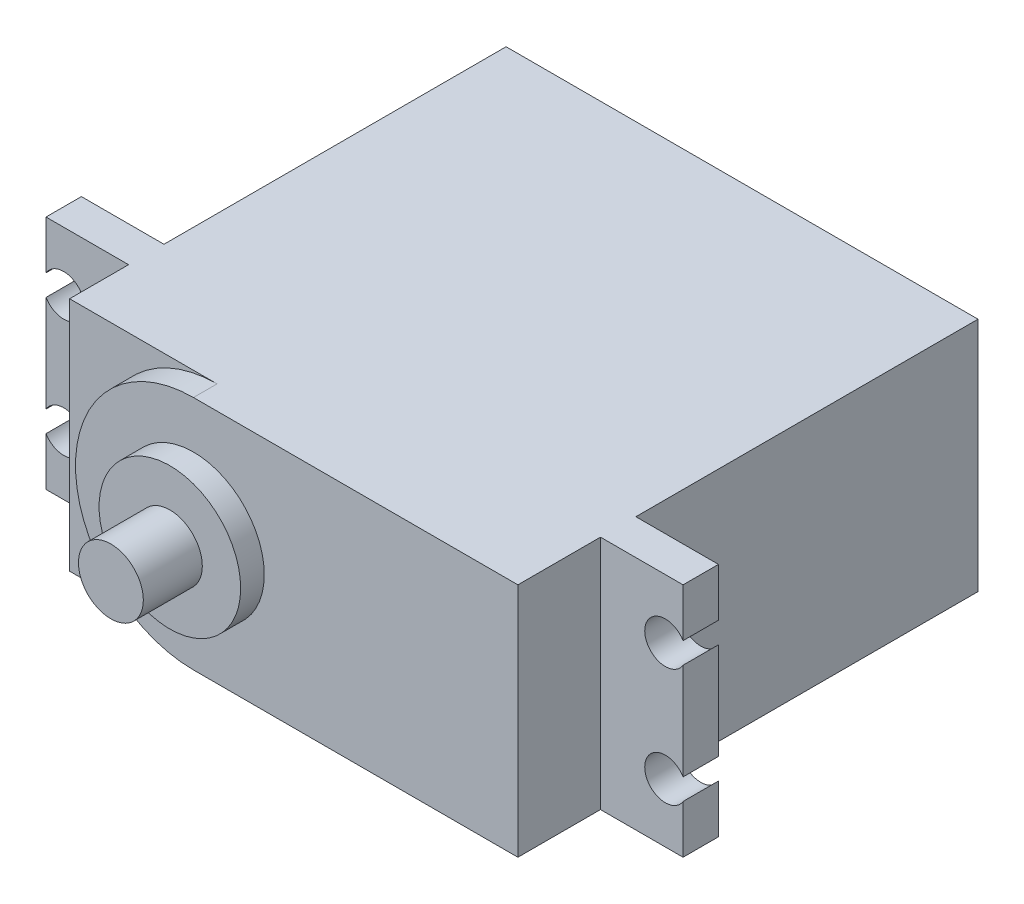
ISO-10303-21;
HEADER;
FILE_DESCRIPTION(('STEP AP214'),'2;1');
FILE_NAME('part.step','',(''),(''),'','','');
FILE_SCHEMA(('AUTOMOTIVE_DESIGN { 1 0 10303 214 1 1 1 1 }'));
ENDSEC;
DATA;
#1=APPLICATION_CONTEXT('core data for automotive mechanical design processes');
#2=APPLICATION_PROTOCOL_DEFINITION('international standard','automotive_design',2000,#1);
#3=PRODUCT_CONTEXT('',#1,'mechanical');
#4=PRODUCT('Part','Part','',(#3));
#5=PRODUCT_RELATED_PRODUCT_CATEGORY('part','',(#4));
#6=PRODUCT_DEFINITION_FORMATION('','',#4);
#7=PRODUCT_DEFINITION_CONTEXT('part definition',#1,'design');
#8=PRODUCT_DEFINITION('design','',#6,#7);
#9=PRODUCT_DEFINITION_SHAPE('','',#8);
#10=(LENGTH_UNIT() NAMED_UNIT(*) SI_UNIT(.MILLI.,.METRE.));
#11=(NAMED_UNIT(*) PLANE_ANGLE_UNIT() SI_UNIT($,.RADIAN.));
#12=(NAMED_UNIT(*) SI_UNIT($,.STERADIAN.) SOLID_ANGLE_UNIT());
#13=UNCERTAINTY_MEASURE_WITH_UNIT(LENGTH_MEASURE(1.E-05),#10,'distance_accuracy_value','');
#14=(GEOMETRIC_REPRESENTATION_CONTEXT(3) GLOBAL_UNCERTAINTY_ASSIGNED_CONTEXT((#13)) GLOBAL_UNIT_ASSIGNED_CONTEXT((#10,
#11,#12)) REPRESENTATION_CONTEXT('',''));
#15=CARTESIAN_POINT('',(0.,0.,0.));
#16=DIRECTION('',(0.,0.,1.));
#17=DIRECTION('',(1.,0.,0.));
#18=AXIS2_PLACEMENT_3D('',#15,#16,#17);
#19=CARTESIAN_POINT('',(-27.,-10.,29.));
#20=DIRECTION('',(-1.,0.,0.));
#21=DIRECTION('',(0.,0.,1.));
#22=AXIS2_PLACEMENT_3D('',#19,#20,#21);
#23=PLANE('',#22);
#24=DIRECTION('',(0.,0.,1.));
#25=VECTOR('',#24,1.);
#26=CARTESIAN_POINT('',(-27.,-5.901387818866,0.));
#27=LINE('',#26,#25);
#28=CARTESIAN_POINT('',(-27.,-5.901387818866,29.));
#29=VERTEX_POINT('',#28);
#30=CARTESIAN_POINT('',(-27.,-5.901387818866,32.));
#31=VERTEX_POINT('',#30);
#32=EDGE_CURVE('E48',#29,#31,#27,.T.);
#33=ORIENTED_EDGE('',*,*,#32,.F.);
#34=DIRECTION('',(0.,-1.,0.));
#35=VECTOR('',#34,1.);
#36=CARTESIAN_POINT('',(-27.,-10.,29.));
#37=LINE('',#36,#35);
#38=CARTESIAN_POINT('',(-27.,-10.,29.));
#39=VERTEX_POINT('',#38);
#40=EDGE_CURVE('E386',#29,#39,#37,.T.);
#41=ORIENTED_EDGE('',*,*,#40,.T.);
#42=DIRECTION('',(0.,0.,1.));
#43=VECTOR('',#42,1.);
#44=CARTESIAN_POINT('',(-27.,-10.,29.));
#45=LINE('',#44,#43);
#46=CARTESIAN_POINT('',(-27.,-10.,32.));
#47=VERTEX_POINT('',#46);
#48=EDGE_CURVE('E274',#39,#47,#45,.T.);
#49=ORIENTED_EDGE('',*,*,#48,.T.);
#50=DIRECTION('',(0.,-1.,0.));
#51=VECTOR('',#50,1.);
#52=CARTESIAN_POINT('',(-27.,-10.,32.));
#53=LINE('',#52,#51);
#54=EDGE_CURVE('E265',#31,#47,#53,.T.);
#55=ORIENTED_EDGE('',*,*,#54,.F.);
#56=EDGE_LOOP('',(#33,#41,#49,#55));
#57=FACE_BOUND('',#56,.T.);
#58=ADVANCED_FACE('F33',(#57),#23,.T.);
#59=DIRECTION('',(0.,0.,1.));
#60=VECTOR('',#59,1.);
#61=CARTESIAN_POINT('',(-27.,-4.09861218113399,0.));
#62=LINE('',#61,#60);
#63=CARTESIAN_POINT('',(-27.,-4.09861218113399,32.));
#64=VERTEX_POINT('',#63);
#65=CARTESIAN_POINT('',(-27.,-4.09861218113399,29.));
#66=VERTEX_POINT('',#65);
#67=EDGE_CURVE('E216',#64,#66,#62,.F.);
#68=ORIENTED_EDGE('',*,*,#67,.F.);
#69=CARTESIAN_POINT('',(-27.,4.09861218113399,32.));
#70=VERTEX_POINT('',#69);
#71=EDGE_CURVE('E259',#70,#64,#53,.T.);
#72=ORIENTED_EDGE('',*,*,#71,.F.);
#73=DIRECTION('',(0.,0.,1.));
#74=VECTOR('',#73,1.);
#75=CARTESIAN_POINT('',(-27.,4.09861218113399,0.));
#76=LINE('',#75,#74);
#77=CARTESIAN_POINT('',(-27.,4.09861218113399,29.));
#78=VERTEX_POINT('',#77);
#79=EDGE_CURVE('E55',#78,#70,#76,.T.);
#80=ORIENTED_EDGE('',*,*,#79,.F.);
#81=EDGE_CURVE('E261',#78,#66,#37,.T.);
#82=ORIENTED_EDGE('',*,*,#81,.T.);
#83=EDGE_LOOP('',(#68,#72,#80,#82));
#84=FACE_BOUND('',#83,.T.);
#85=ADVANCED_FACE('F258',(#84),#23,.T.);
#86=CARTESIAN_POINT('',(27.,-10.,29.));
#87=DIRECTION('',(1.,0.,0.));
#88=DIRECTION('',(0.,0.,-1.));
#89=AXIS2_PLACEMENT_3D('',#86,#87,#88);
#90=PLANE('',#89);
#91=DIRECTION('',(0.,0.,1.));
#92=VECTOR('',#91,1.);
#93=CARTESIAN_POINT('',(27.,5.90138781886601,0.));
#94=LINE('',#93,#92);
#95=CARTESIAN_POINT('',(27.,5.90138781886601,29.));
#96=VERTEX_POINT('',#95);
#97=CARTESIAN_POINT('',(27.,5.90138781886601,32.));
#98=VERTEX_POINT('',#97);
#99=EDGE_CURVE('E241',#96,#98,#94,.T.);
#100=ORIENTED_EDGE('',*,*,#99,.F.);
#101=DIRECTION('',(0.,1.,0.));
#102=VECTOR('',#101,1.);
#103=CARTESIAN_POINT('',(27.,-10.,29.));
#104=LINE('',#103,#102);
#105=CARTESIAN_POINT('',(27.,10.,29.));
#106=VERTEX_POINT('',#105);
#107=EDGE_CURVE('E227',#96,#106,#104,.T.);
#108=ORIENTED_EDGE('',*,*,#107,.T.);
#109=DIRECTION('',(0.,0.,1.));
#110=VECTOR('',#109,1.);
#111=CARTESIAN_POINT('',(27.,10.,29.));
#112=LINE('',#111,#110);
#113=CARTESIAN_POINT('',(27.,10.,32.));
#114=VERTEX_POINT('',#113);
#115=EDGE_CURVE('E358',#106,#114,#112,.T.);
#116=ORIENTED_EDGE('',*,*,#115,.T.);
#117=DIRECTION('',(0.,1.,0.));
#118=VECTOR('',#117,1.);
#119=CARTESIAN_POINT('',(27.,-10.,32.));
#120=LINE('',#119,#118);
#121=EDGE_CURVE('E210',#98,#114,#120,.T.);
#122=ORIENTED_EDGE('',*,*,#121,.F.);
#123=EDGE_LOOP('',(#100,#108,#116,#122));
#124=FACE_BOUND('',#123,.T.);
#125=ADVANCED_FACE('F357',(#124),#90,.T.);
#126=DIRECTION('',(0.,0.,1.));
#127=VECTOR('',#126,1.);
#128=CARTESIAN_POINT('',(27.,4.09861218113399,0.));
#129=LINE('',#128,#127);
#130=CARTESIAN_POINT('',(27.,4.09861218113399,32.));
#131=VERTEX_POINT('',#130);
#132=CARTESIAN_POINT('',(27.,4.09861218113399,29.));
#133=VERTEX_POINT('',#132);
#134=EDGE_CURVE('E243',#131,#133,#129,.F.);
#135=ORIENTED_EDGE('',*,*,#134,.F.);
#136=CARTESIAN_POINT('',(27.,-4.09861218113399,32.));
#137=VERTEX_POINT('',#136);
#138=EDGE_CURVE('E208',#137,#131,#120,.T.);
#139=ORIENTED_EDGE('',*,*,#138,.F.);
#140=DIRECTION('',(0.,0.,1.));
#141=VECTOR('',#140,1.);
#142=CARTESIAN_POINT('',(27.,-4.09861218113399,0.));
#143=LINE('',#142,#141);
#144=CARTESIAN_POINT('',(27.,-4.09861218113399,29.));
#145=VERTEX_POINT('',#144);
#146=EDGE_CURVE('E186',#145,#137,#143,.T.);
#147=ORIENTED_EDGE('',*,*,#146,.F.);
#148=EDGE_CURVE('E226',#145,#133,#104,.T.);
#149=ORIENTED_EDGE('',*,*,#148,.T.);
#150=EDGE_LOOP('',(#135,#139,#147,#149));
#151=FACE_BOUND('',#150,.T.);
#152=ADVANCED_FACE('F351',(#151),#90,.T.);
#153=CARTESIAN_POINT('',(20.,-10.,37.));
#154=DIRECTION('',(-1.,0.,0.));
#155=DIRECTION('',(0.,0.,1.));
#156=AXIS2_PLACEMENT_3D('',#153,#154,#155);
#157=PLANE('',#156);
#158=DIRECTION('',(0.,-1.,0.));
#159=VECTOR('',#158,1.);
#160=CARTESIAN_POINT('',(20.,-10.,32.));
#161=LINE('',#160,#159);
#162=CARTESIAN_POINT('',(20.,10.,32.));
#163=VERTEX_POINT('',#162);
#164=CARTESIAN_POINT('',(20.,-10.,32.));
#165=VERTEX_POINT('',#164);
#166=EDGE_CURVE('E211',#163,#165,#161,.T.);
#167=ORIENTED_EDGE('',*,*,#166,.F.);
#168=DIRECTION('',(0.,0.,-1.));
#169=VECTOR('',#168,1.);
#170=CARTESIAN_POINT('',(20.,10.,37.));
#171=LINE('',#170,#169);
#172=CARTESIAN_POINT('',(20.,10.,39.));
#173=VERTEX_POINT('',#172);
#174=EDGE_CURVE('E287',#173,#163,#171,.T.);
#175=ORIENTED_EDGE('',*,*,#174,.F.);
#176=DIRECTION('',(0.,1.,0.));
#177=VECTOR('',#176,1.);
#178=CARTESIAN_POINT('',(20.,10.,39.));
#179=LINE('',#178,#177);
#180=CARTESIAN_POINT('',(20.,-10.,39.));
#181=VERTEX_POINT('',#180);
#182=EDGE_CURVE('E300',#181,#173,#179,.T.);
#183=ORIENTED_EDGE('',*,*,#182,.F.);
#184=DIRECTION('',(0.,0.,-1.));
#185=VECTOR('',#184,1.);
#186=CARTESIAN_POINT('',(20.,-10.,37.));
#187=LINE('',#186,#185);
#188=EDGE_CURVE('E332',#181,#165,#187,.T.);
#189=ORIENTED_EDGE('',*,*,#188,.T.);
#190=EDGE_LOOP('',(#167,#175,#183,#189));
#191=FACE_BOUND('',#190,.T.);
#192=ADVANCED_FACE('F418',(#191),#157,.F.);
#193=CARTESIAN_POINT('',(-20.,-10.,37.));
#194=DIRECTION('',(1.,0.,0.));
#195=DIRECTION('',(0.,0.,-1.));
#196=AXIS2_PLACEMENT_3D('',#193,#194,#195);
#197=PLANE('',#196);
#198=DIRECTION('',(0.,1.,0.));
#199=VECTOR('',#198,1.);
#200=CARTESIAN_POINT('',(-20.,-10.,32.));
#201=LINE('',#200,#199);
#202=CARTESIAN_POINT('',(-20.,-10.,32.));
#203=VERTEX_POINT('',#202);
#204=CARTESIAN_POINT('',(-20.,10.,32.));
#205=VERTEX_POINT('',#204);
#206=EDGE_CURVE('E364',#203,#205,#201,.T.);
#207=ORIENTED_EDGE('',*,*,#206,.F.);
#208=DIRECTION('',(0.,0.,-1.));
#209=VECTOR('',#208,1.);
#210=CARTESIAN_POINT('',(-20.,-10.,37.));
#211=LINE('',#210,#209);
#212=CARTESIAN_POINT('',(-20.,-10.,37.));
#213=VERTEX_POINT('',#212);
#214=EDGE_CURVE('E336',#213,#203,#211,.T.);
#215=ORIENTED_EDGE('',*,*,#214,.F.);
#216=DIRECTION('',(0.,-1.,0.));
#217=VECTOR('',#216,1.);
#218=CARTESIAN_POINT('',(-20.,-10.,37.));
#219=LINE('',#218,#217);
#220=CARTESIAN_POINT('',(-20.,10.,37.));
#221=VERTEX_POINT('',#220);
#222=EDGE_CURVE('E316',#221,#213,#219,.T.);
#223=ORIENTED_EDGE('',*,*,#222,.F.);
#224=DIRECTION('',(0.,0.,-1.));
#225=VECTOR('',#224,1.);
#226=CARTESIAN_POINT('',(-20.,10.,37.));
#227=LINE('',#226,#225);
#228=EDGE_CURVE('E340',#221,#205,#227,.T.);
#229=ORIENTED_EDGE('',*,*,#228,.T.);
#230=EDGE_LOOP('',(#207,#215,#223,#229));
#231=FACE_BOUND('',#230,.T.);
#232=ADVANCED_FACE('F404',(#231),#197,.F.);
#233=CARTESIAN_POINT('',(20.,10.,29.));
#234=VERTEX_POINT('',#233);
#235=CARTESIAN_POINT('',(20.,10.,0.));
#236=VERTEX_POINT('',#235);
#237=EDGE_CURVE('E343',#234,#236,#171,.T.);
#238=ORIENTED_EDGE('',*,*,#237,.F.);
#239=DIRECTION('',(0.,-1.,0.));
#240=VECTOR('',#239,1.);
#241=CARTESIAN_POINT('',(20.,-10.,29.));
#242=LINE('',#241,#240);
#243=CARTESIAN_POINT('',(20.,-10.,29.));
#244=VERTEX_POINT('',#243);
#245=EDGE_CURVE('E219',#234,#244,#242,.T.);
#246=ORIENTED_EDGE('',*,*,#245,.T.);
#247=CARTESIAN_POINT('',(20.,-10.,0.));
#248=VERTEX_POINT('',#247);
#249=EDGE_CURVE('E321',#244,#248,#187,.T.);
#250=ORIENTED_EDGE('',*,*,#249,.T.);
#251=DIRECTION('',(0.,1.,0.));
#252=VECTOR('',#251,1.);
#253=CARTESIAN_POINT('',(20.,-10.,0.));
#254=LINE('',#253,#252);
#255=EDGE_CURVE('E313',#248,#236,#254,.T.);
#256=ORIENTED_EDGE('',*,*,#255,.T.);
#257=EDGE_LOOP('',(#238,#246,#250,#256));
#258=FACE_BOUND('',#257,.T.);
#259=ADVANCED_FACE('F35',(#258),#157,.F.);
#260=CARTESIAN_POINT('',(-20.,10.,37.));
#261=DIRECTION('',(0.,-1.,0.));
#262=DIRECTION('',(0.,0.,-1.));
#263=AXIS2_PLACEMENT_3D('',#260,#261,#262);
#264=PLANE('',#263);
#265=DIRECTION('',(-1.,0.,0.));
#266=VECTOR('',#265,1.);
#267=CARTESIAN_POINT('',(-20.,10.,0.));
#268=LINE('',#267,#266);
#269=CARTESIAN_POINT('',(-20.,10.,0.));
#270=VERTEX_POINT('',#269);
#271=EDGE_CURVE('E324',#236,#270,#268,.T.);
#272=ORIENTED_EDGE('',*,*,#271,.T.);
#273=CARTESIAN_POINT('',(-20.,10.,29.));
#274=VERTEX_POINT('',#273);
#275=EDGE_CURVE('E339',#274,#270,#227,.T.);
#276=ORIENTED_EDGE('',*,*,#275,.F.);
#277=DIRECTION('',(-1.,0.,0.));
#278=VECTOR('',#277,1.);
#279=CARTESIAN_POINT('',(-20.,10.,29.));
#280=LINE('',#279,#278);
#281=CARTESIAN_POINT('',(-27.,10.,29.));
#282=VERTEX_POINT('',#281);
#283=EDGE_CURVE('E382',#274,#282,#280,.T.);
#284=ORIENTED_EDGE('',*,*,#283,.T.);
#285=DIRECTION('',(0.,0.,1.));
#286=VECTOR('',#285,1.);
#287=CARTESIAN_POINT('',(-27.,10.,29.));
#288=LINE('',#287,#286);
#289=CARTESIAN_POINT('',(-27.,10.,32.));
#290=VERTEX_POINT('',#289);
#291=EDGE_CURVE('E278',#282,#290,#288,.T.);
#292=ORIENTED_EDGE('',*,*,#291,.T.);
#293=DIRECTION('',(-1.,0.,0.));
#294=VECTOR('',#293,1.);
#295=CARTESIAN_POINT('',(-20.,10.,32.));
#296=LINE('',#295,#294);
#297=EDGE_CURVE('E268',#205,#290,#296,.T.);
#298=ORIENTED_EDGE('',*,*,#297,.F.);
#299=ORIENTED_EDGE('',*,*,#228,.F.);
#300=DIRECTION('',(-1.,0.,0.));
#301=VECTOR('',#300,1.);
#302=CARTESIAN_POINT('',(-20.,10.,37.));
#303=LINE('',#302,#301);
#304=CARTESIAN_POINT('',(-7.5,10.,37.));
#305=VERTEX_POINT('',#304);
#306=EDGE_CURVE('E314',#305,#221,#303,.T.);
#307=ORIENTED_EDGE('',*,*,#306,.F.);
#308=DIRECTION('',(0.,0.,-1.));
#309=VECTOR('',#308,1.);
#310=CARTESIAN_POINT('',(-7.5,10.,39.));
#311=LINE('',#310,#309);
#312=CARTESIAN_POINT('',(-7.5,10.,39.));
#313=VERTEX_POINT('',#312);
#314=EDGE_CURVE('E305',#313,#305,#311,.T.);
#315=ORIENTED_EDGE('',*,*,#314,.F.);
#316=DIRECTION('',(-1.,0.,0.));
#317=VECTOR('',#316,1.);
#318=CARTESIAN_POINT('',(-7.5,10.,39.));
#319=LINE('',#318,#317);
#320=EDGE_CURVE('E303',#173,#313,#319,.T.);
#321=ORIENTED_EDGE('',*,*,#320,.F.);
#322=ORIENTED_EDGE('',*,*,#174,.T.);
#323=DIRECTION('',(-1.,0.,0.));
#324=VECTOR('',#323,1.);
#325=CARTESIAN_POINT('',(20.,10.,32.));
#326=LINE('',#325,#324);
#327=EDGE_CURVE('E207',#114,#163,#326,.T.);
#328=ORIENTED_EDGE('',*,*,#327,.F.);
#329=ORIENTED_EDGE('',*,*,#115,.F.);
#330=DIRECTION('',(-1.,0.,0.));
#331=VECTOR('',#330,1.);
#332=CARTESIAN_POINT('',(20.,10.,29.));
#333=LINE('',#332,#331);
#334=EDGE_CURVE('E223',#106,#234,#333,.T.);
#335=ORIENTED_EDGE('',*,*,#334,.T.);
#336=ORIENTED_EDGE('',*,*,#237,.T.);
#337=EDGE_LOOP('',(#272,#276,#284,#292,#298,#299,#307,#315,#321,#322,#328,#329,#335,#336));
#338=FACE_BOUND('',#337,.T.);
#339=ADVANCED_FACE('F362',(#338),#264,.F.);
#340=CARTESIAN_POINT('',(-20.,-10.,29.));
#341=VERTEX_POINT('',#340);
#342=CARTESIAN_POINT('',(-20.,-10.,0.));
#343=VERTEX_POINT('',#342);
#344=EDGE_CURVE('E335',#341,#343,#211,.T.);
#345=ORIENTED_EDGE('',*,*,#344,.F.);
#346=DIRECTION('',(0.,1.,0.));
#347=VECTOR('',#346,1.);
#348=CARTESIAN_POINT('',(-20.,-10.,29.));
#349=LINE('',#348,#347);
#350=EDGE_CURVE('E273',#341,#274,#349,.T.);
#351=ORIENTED_EDGE('',*,*,#350,.T.);
#352=ORIENTED_EDGE('',*,*,#275,.T.);
#353=DIRECTION('',(0.,-1.,0.));
#354=VECTOR('',#353,1.);
#355=CARTESIAN_POINT('',(-20.,-10.,0.));
#356=LINE('',#355,#354);
#357=EDGE_CURVE('E327',#270,#343,#356,.T.);
#358=ORIENTED_EDGE('',*,*,#357,.T.);
#359=EDGE_LOOP('',(#345,#351,#352,#358));
#360=FACE_BOUND('',#359,.T.);
#361=ADVANCED_FACE('F379',(#360),#197,.F.);
#362=CARTESIAN_POINT('',(-20.,-10.,37.));
#363=DIRECTION('',(0.,1.,0.));
#364=DIRECTION('',(0.,0.,1.));
#365=AXIS2_PLACEMENT_3D('',#362,#363,#364);
#366=PLANE('',#365);
#367=DIRECTION('',(1.,0.,0.));
#368=VECTOR('',#367,1.);
#369=CARTESIAN_POINT('',(-20.,-10.,0.));
#370=LINE('',#369,#368);
#371=EDGE_CURVE('E317',#343,#248,#370,.T.);
#372=ORIENTED_EDGE('',*,*,#371,.T.);
#373=ORIENTED_EDGE('',*,*,#249,.F.);
#374=DIRECTION('',(1.,0.,0.));
#375=VECTOR('',#374,1.);
#376=CARTESIAN_POINT('',(20.,-10.,29.));
#377=LINE('',#376,#375);
#378=CARTESIAN_POINT('',(27.,-10.,29.));
#379=VERTEX_POINT('',#378);
#380=EDGE_CURVE('E228',#244,#379,#377,.T.);
#381=ORIENTED_EDGE('',*,*,#380,.T.);
#382=DIRECTION('',(0.,0.,1.));
#383=VECTOR('',#382,1.);
#384=CARTESIAN_POINT('',(27.,-10.,29.));
#385=LINE('',#384,#383);
#386=CARTESIAN_POINT('',(27.,-10.,32.));
#387=VERTEX_POINT('',#386);
#388=EDGE_CURVE('E222',#379,#387,#385,.T.);
#389=ORIENTED_EDGE('',*,*,#388,.T.);
#390=DIRECTION('',(1.,0.,0.));
#391=VECTOR('',#390,1.);
#392=CARTESIAN_POINT('',(20.,-10.,32.));
#393=LINE('',#392,#391);
#394=EDGE_CURVE('E206',#165,#387,#393,.T.);
#395=ORIENTED_EDGE('',*,*,#394,.F.);
#396=ORIENTED_EDGE('',*,*,#188,.F.);
#397=DIRECTION('',(1.,0.,0.));
#398=VECTOR('',#397,1.);
#399=CARTESIAN_POINT('',(20.,-10.,39.));
#400=LINE('',#399,#398);
#401=CARTESIAN_POINT('',(-7.5,-10.,39.));
#402=VERTEX_POINT('',#401);
#403=EDGE_CURVE('E297',#402,#181,#400,.T.);
#404=ORIENTED_EDGE('',*,*,#403,.F.);
#405=DIRECTION('',(0.,0.,-1.));
#406=VECTOR('',#405,1.);
#407=CARTESIAN_POINT('',(-7.5,-10.,39.));
#408=LINE('',#407,#406);
#409=CARTESIAN_POINT('',(-7.5,-10.,37.));
#410=VERTEX_POINT('',#409);
#411=EDGE_CURVE('E310',#402,#410,#408,.T.);
#412=ORIENTED_EDGE('',*,*,#411,.T.);
#413=DIRECTION('',(1.,0.,0.));
#414=VECTOR('',#413,1.);
#415=CARTESIAN_POINT('',(-20.,-10.,37.));
#416=LINE('',#415,#414);
#417=EDGE_CURVE('E319',#213,#410,#416,.T.);
#418=ORIENTED_EDGE('',*,*,#417,.F.);
#419=ORIENTED_EDGE('',*,*,#214,.T.);
#420=DIRECTION('',(1.,0.,0.));
#421=VECTOR('',#420,1.);
#422=CARTESIAN_POINT('',(-20.,-10.,32.));
#423=LINE('',#422,#421);
#424=EDGE_CURVE('E267',#47,#203,#423,.T.);
#425=ORIENTED_EDGE('',*,*,#424,.F.);
#426=ORIENTED_EDGE('',*,*,#48,.F.);
#427=DIRECTION('',(1.,0.,0.));
#428=VECTOR('',#427,1.);
#429=CARTESIAN_POINT('',(-20.,-10.,29.));
#430=LINE('',#429,#428);
#431=EDGE_CURVE('E280',#39,#341,#430,.T.);
#432=ORIENTED_EDGE('',*,*,#431,.T.);
#433=ORIENTED_EDGE('',*,*,#344,.T.);
#434=EDGE_LOOP('',(#372,#373,#381,#389,#395,#396,#404,#412,#418,#419,#425,#426,#432,#433));
#435=FACE_BOUND('',#434,.T.);
#436=ADVANCED_FACE('F421',(#435),#366,.F.);
#437=CARTESIAN_POINT('',(0.,0.,37.));
#438=DIRECTION('',(0.,0.,-1.));
#439=DIRECTION('',(-1.,0.,0.));
#440=AXIS2_PLACEMENT_3D('',#437,#438,#439);
#441=PLANE('',#440);
#442=CARTESIAN_POINT('',(-7.5,0.,37.));
#443=DIRECTION('',(0.,0.,1.));
#444=DIRECTION('',(1.,0.,0.));
#445=AXIS2_PLACEMENT_3D('',#442,#443,#444);
#446=CIRCLE('',#445,10.);
#447=EDGE_CURVE('E291',#305,#410,#446,.T.);
#448=ORIENTED_EDGE('',*,*,#447,.F.);
#449=ORIENTED_EDGE('',*,*,#306,.T.);
#450=ORIENTED_EDGE('',*,*,#222,.T.);
#451=ORIENTED_EDGE('',*,*,#417,.T.);
#452=EDGE_LOOP('',(#448,#449,#450,#451));
#453=FACE_BOUND('',#452,.T.);
#454=ADVANCED_FACE('F407',(#453),#441,.F.);
#455=CARTESIAN_POINT('',(0.,0.,0.));
#456=DIRECTION('',(0.,0.,-1.));
#457=DIRECTION('',(-1.,0.,0.));
#458=AXIS2_PLACEMENT_3D('',#455,#456,#457);
#459=PLANE('',#458);
#460=ORIENTED_EDGE('',*,*,#255,.F.);
#461=ORIENTED_EDGE('',*,*,#371,.F.);
#462=ORIENTED_EDGE('',*,*,#357,.F.);
#463=ORIENTED_EDGE('',*,*,#271,.F.);
#464=EDGE_LOOP('',(#460,#461,#462,#463));
#465=FACE_BOUND('',#464,.T.);
#466=ADVANCED_FACE('F375',(#465),#459,.T.);
#467=CARTESIAN_POINT('',(-7.5,0.,39.));
#468=DIRECTION('',(0.,0.,-1.));
#469=DIRECTION('',(-1.,0.,0.));
#470=AXIS2_PLACEMENT_3D('',#467,#468,#469);
#471=CYLINDRICAL_SURFACE('',#470,10.);
#472=ORIENTED_EDGE('',*,*,#447,.T.);
#473=ORIENTED_EDGE('',*,*,#411,.F.);
#474=CARTESIAN_POINT('',(-7.5,0.,39.));
#475=DIRECTION('',(0.,0.,1.));
#476=DIRECTION('',(1.,0.,0.));
#477=AXIS2_PLACEMENT_3D('',#474,#475,#476);
#478=CIRCLE('',#477,10.);
#479=EDGE_CURVE('E294',#313,#402,#478,.T.);
#480=ORIENTED_EDGE('',*,*,#479,.F.);
#481=ORIENTED_EDGE('',*,*,#314,.T.);
#482=EDGE_LOOP('',(#472,#473,#480,#481));
#483=FACE_BOUND('',#482,.T.);
#484=ADVANCED_FACE('F410',(#483),#471,.T.);
#485=CARTESIAN_POINT('',(-7.5,0.,39.));
#486=DIRECTION('',(0.,0.,1.));
#487=DIRECTION('',(1.,0.,0.));
#488=AXIS2_PLACEMENT_3D('',#485,#486,#487);
#489=PLANE('',#488);
#490=CARTESIAN_POINT('',(-7.5,0.,39.));
#491=DIRECTION('',(0.,0.,1.));
#492=DIRECTION('',(1.,0.,0.));
#493=AXIS2_PLACEMENT_3D('',#490,#491,#492);
#494=CIRCLE('',#493,6.);
#495=CARTESIAN_POINT('',(-1.5,0.,39.));
#496=VERTEX_POINT('',#495);
#497=EDGE_CURVE('E283',#496,#496,#494,.T.);
#498=ORIENTED_EDGE('',*,*,#497,.F.);
#499=EDGE_LOOP('',(#498));
#500=FACE_BOUND('',#499,.T.);
#501=ORIENTED_EDGE('',*,*,#479,.T.);
#502=ORIENTED_EDGE('',*,*,#403,.T.);
#503=ORIENTED_EDGE('',*,*,#182,.T.);
#504=ORIENTED_EDGE('',*,*,#320,.T.);
#505=EDGE_LOOP('',(#501,#502,#503,#504));
#506=FACE_BOUND('',#505,.T.);
#507=ADVANCED_FACE('F414',(#500,#506),#489,.T.);
#508=CARTESIAN_POINT('',(-7.5,0.,41.));
#509=DIRECTION('',(0.,0.,-1.));
#510=DIRECTION('',(-1.,0.,0.));
#511=AXIS2_PLACEMENT_3D('',#508,#509,#510);
#512=CYLINDRICAL_SURFACE('',#511,6.);
#513=CARTESIAN_POINT('',(-7.5,0.,41.));
#514=DIRECTION('',(0.,0.,1.));
#515=DIRECTION('',(1.,0.,0.));
#516=AXIS2_PLACEMENT_3D('',#513,#514,#515);
#517=CIRCLE('',#516,6.);
#518=CARTESIAN_POINT('',(-1.5,0.,41.));
#519=VERTEX_POINT('',#518);
#520=EDGE_CURVE('E288',#519,#519,#517,.T.);
#521=ORIENTED_EDGE('',*,*,#520,.F.);
#522=EDGE_LOOP('',(#521));
#523=FACE_BOUND('',#522,.T.);
#524=ORIENTED_EDGE('',*,*,#497,.T.);
#525=EDGE_LOOP('',(#524));
#526=FACE_BOUND('',#525,.T.);
#527=ADVANCED_FACE('F619',(#523,#526),#512,.T.);
#528=CARTESIAN_POINT('',(-7.5,0.,41.));
#529=DIRECTION('',(0.,0.,1.));
#530=DIRECTION('',(1.,0.,0.));
#531=AXIS2_PLACEMENT_3D('',#528,#529,#530);
#532=PLANE('',#531);
#533=CARTESIAN_POINT('',(-7.5,0.,41.));
#534=DIRECTION('',(0.,0.,1.));
#535=DIRECTION('',(1.,0.,0.));
#536=AXIS2_PLACEMENT_3D('',#533,#534,#535);
#537=CIRCLE('',#536,2.75);
#538=CARTESIAN_POINT('',(-4.75,0.,41.));
#539=VERTEX_POINT('',#538);
#540=EDGE_CURVE('E284',#539,#539,#537,.T.);
#541=ORIENTED_EDGE('',*,*,#540,.F.);
#542=EDGE_LOOP('',(#541));
#543=FACE_BOUND('',#542,.T.);
#544=ORIENTED_EDGE('',*,*,#520,.T.);
#545=EDGE_LOOP('',(#544));
#546=FACE_BOUND('',#545,.T.);
#547=ADVANCED_FACE('F609',(#543,#546),#532,.T.);
#548=CARTESIAN_POINT('',(-7.5,0.,46.));
#549=DIRECTION('',(0.,0.,-1.));
#550=DIRECTION('',(-1.,0.,0.));
#551=AXIS2_PLACEMENT_3D('',#548,#549,#550);
#552=CYLINDRICAL_SURFACE('',#551,2.75);
#553=CARTESIAN_POINT('',(-7.5,0.,46.));
#554=DIRECTION('',(0.,0.,1.));
#555=DIRECTION('',(1.,0.,0.));
#556=AXIS2_PLACEMENT_3D('',#553,#554,#555);
#557=CIRCLE('',#556,2.75);
#558=CARTESIAN_POINT('',(-4.75,0.,46.));
#559=VERTEX_POINT('',#558);
#560=EDGE_CURVE('E277',#559,#559,#557,.T.);
#561=ORIENTED_EDGE('',*,*,#560,.F.);
#562=EDGE_LOOP('',(#561));
#563=FACE_BOUND('',#562,.T.);
#564=ORIENTED_EDGE('',*,*,#540,.T.);
#565=EDGE_LOOP('',(#564));
#566=FACE_BOUND('',#565,.T.);
#567=ADVANCED_FACE('F444',(#563,#566),#552,.T.);
#568=CARTESIAN_POINT('',(-7.5,0.,46.));
#569=DIRECTION('',(0.,0.,1.));
#570=DIRECTION('',(1.,0.,0.));
#571=AXIS2_PLACEMENT_3D('',#568,#569,#570);
#572=PLANE('',#571);
#573=ORIENTED_EDGE('',*,*,#560,.T.);
#574=EDGE_LOOP('',(#573));
#575=FACE_BOUND('',#574,.T.);
#576=ADVANCED_FACE('F437',(#575),#572,.T.);
#577=DIRECTION('',(0.,0.,1.));
#578=VECTOR('',#577,1.);
#579=CARTESIAN_POINT('',(-27.,5.90138781886601,0.));
#580=LINE('',#579,#578);
#581=CARTESIAN_POINT('',(-27.,5.90138781886601,32.));
#582=VERTEX_POINT('',#581);
#583=CARTESIAN_POINT('',(-27.,5.90138781886601,29.));
#584=VERTEX_POINT('',#583);
#585=EDGE_CURVE('E236',#582,#584,#580,.F.);
#586=ORIENTED_EDGE('',*,*,#585,.F.);
#587=EDGE_CURVE('E264',#290,#582,#53,.T.);
#588=ORIENTED_EDGE('',*,*,#587,.F.);
#589=ORIENTED_EDGE('',*,*,#291,.F.);
#590=EDGE_CURVE('E389',#282,#584,#37,.T.);
#591=ORIENTED_EDGE('',*,*,#590,.T.);
#592=EDGE_LOOP('',(#586,#588,#589,#591));
#593=FACE_BOUND('',#592,.T.);
#594=ADVANCED_FACE('F430',(#593),#23,.T.);
#595=CARTESIAN_POINT('',(0.,0.,29.));
#596=DIRECTION('',(0.,0.,1.));
#597=DIRECTION('',(1.,0.,0.));
#598=AXIS2_PLACEMENT_3D('',#595,#596,#597);
#599=PLANE('',#598);
#600=ORIENTED_EDGE('',*,*,#40,.F.);
#601=CARTESIAN_POINT('',(-25.5,-5.,29.));
#602=DIRECTION('',(0.,0.,1.));
#603=DIRECTION('',(1.,0.,0.));
#604=AXIS2_PLACEMENT_3D('',#601,#602,#603);
#605=CIRCLE('',#604,1.75);
#606=EDGE_CURVE('E232',#29,#66,#605,.T.);
#607=ORIENTED_EDGE('',*,*,#606,.T.);
#608=ORIENTED_EDGE('',*,*,#81,.F.);
#609=CARTESIAN_POINT('',(-25.5,5.,29.));
#610=DIRECTION('',(0.,0.,1.));
#611=DIRECTION('',(1.,0.,0.));
#612=AXIS2_PLACEMENT_3D('',#609,#610,#611);
#613=CIRCLE('',#612,1.75);
#614=EDGE_CURVE('E238',#78,#584,#613,.T.);
#615=ORIENTED_EDGE('',*,*,#614,.T.);
#616=ORIENTED_EDGE('',*,*,#590,.F.);
#617=ORIENTED_EDGE('',*,*,#283,.F.);
#618=ORIENTED_EDGE('',*,*,#350,.F.);
#619=ORIENTED_EDGE('',*,*,#431,.F.);
#620=EDGE_LOOP('',(#600,#607,#608,#615,#616,#617,#618,#619));
#621=FACE_BOUND('',#620,.T.);
#622=ADVANCED_FACE('F426',(#621),#599,.F.);
#623=CARTESIAN_POINT('',(0.,0.,32.));
#624=DIRECTION('',(0.,0.,1.));
#625=DIRECTION('',(1.,0.,0.));
#626=AXIS2_PLACEMENT_3D('',#623,#624,#625);
#627=PLANE('',#626);
#628=CARTESIAN_POINT('',(-25.5,-5.,32.));
#629=DIRECTION('',(0.,0.,1.));
#630=DIRECTION('',(-1.,0.,0.));
#631=AXIS2_PLACEMENT_3D('',#628,#629,#630);
#632=CIRCLE('',#631,1.75);
#633=EDGE_CURVE('E191',#31,#64,#632,.T.);
#634=ORIENTED_EDGE('',*,*,#633,.F.);
#635=ORIENTED_EDGE('',*,*,#54,.T.);
#636=ORIENTED_EDGE('',*,*,#424,.T.);
#637=ORIENTED_EDGE('',*,*,#206,.T.);
#638=ORIENTED_EDGE('',*,*,#297,.T.);
#639=ORIENTED_EDGE('',*,*,#587,.T.);
#640=CARTESIAN_POINT('',(-25.5,5.,32.));
#641=DIRECTION('',(0.,0.,1.));
#642=DIRECTION('',(1.,0.,0.));
#643=AXIS2_PLACEMENT_3D('',#640,#641,#642);
#644=CIRCLE('',#643,1.75);
#645=EDGE_CURVE('E11',#70,#582,#644,.T.);
#646=ORIENTED_EDGE('',*,*,#645,.F.);
#647=ORIENTED_EDGE('',*,*,#71,.T.);
#648=EDGE_LOOP('',(#634,#635,#636,#637,#638,#639,#646,#647));
#649=FACE_BOUND('',#648,.T.);
#650=ADVANCED_FACE('F262',(#649),#627,.T.);
#651=DIRECTION('',(0.,0.,1.));
#652=VECTOR('',#651,1.);
#653=CARTESIAN_POINT('',(27.,-5.901387818866,0.));
#654=LINE('',#653,#652);
#655=CARTESIAN_POINT('',(27.,-5.901387818866,32.));
#656=VERTEX_POINT('',#655);
#657=CARTESIAN_POINT('',(27.,-5.901387818866,29.));
#658=VERTEX_POINT('',#657);
#659=EDGE_CURVE('E183',#656,#658,#654,.F.);
#660=ORIENTED_EDGE('',*,*,#659,.F.);
#661=EDGE_CURVE('E197',#387,#656,#120,.T.);
#662=ORIENTED_EDGE('',*,*,#661,.F.);
#663=ORIENTED_EDGE('',*,*,#388,.F.);
#664=EDGE_CURVE('E200',#379,#658,#104,.T.);
#665=ORIENTED_EDGE('',*,*,#664,.T.);
#666=EDGE_LOOP('',(#660,#662,#663,#665));
#667=FACE_BOUND('',#666,.T.);
#668=ADVANCED_FACE('F196',(#667),#90,.T.);
#669=CARTESIAN_POINT('',(0.,0.,29.));
#670=DIRECTION('',(0.,0.,1.));
#671=DIRECTION('',(1.,0.,0.));
#672=AXIS2_PLACEMENT_3D('',#669,#670,#671);
#673=PLANE('',#672);
#674=ORIENTED_EDGE('',*,*,#107,.F.);
#675=CARTESIAN_POINT('',(25.5,5.,29.));
#676=DIRECTION('',(0.,0.,1.));
#677=DIRECTION('',(1.,0.,0.));
#678=AXIS2_PLACEMENT_3D('',#675,#676,#677);
#679=CIRCLE('',#678,1.75);
#680=EDGE_CURVE('E245',#96,#133,#679,.T.);
#681=ORIENTED_EDGE('',*,*,#680,.T.);
#682=ORIENTED_EDGE('',*,*,#148,.F.);
#683=CARTESIAN_POINT('',(25.5,-5.,29.));
#684=DIRECTION('',(0.,0.,1.));
#685=DIRECTION('',(1.,0.,0.));
#686=AXIS2_PLACEMENT_3D('',#683,#684,#685);
#687=CIRCLE('',#686,1.75);
#688=EDGE_CURVE('E201',#145,#658,#687,.T.);
#689=ORIENTED_EDGE('',*,*,#688,.T.);
#690=ORIENTED_EDGE('',*,*,#664,.F.);
#691=ORIENTED_EDGE('',*,*,#380,.F.);
#692=ORIENTED_EDGE('',*,*,#245,.F.);
#693=ORIENTED_EDGE('',*,*,#334,.F.);
#694=EDGE_LOOP('',(#674,#681,#682,#689,#690,#691,#692,#693));
#695=FACE_BOUND('',#694,.T.);
#696=ADVANCED_FACE('F366',(#695),#673,.F.);
#697=CARTESIAN_POINT('',(0.,0.,32.));
#698=DIRECTION('',(0.,0.,1.));
#699=DIRECTION('',(1.,0.,0.));
#700=AXIS2_PLACEMENT_3D('',#697,#698,#699);
#701=PLANE('',#700);
#702=CARTESIAN_POINT('',(25.5,5.,32.));
#703=DIRECTION('',(0.,0.,1.));
#704=DIRECTION('',(1.,0.,0.));
#705=AXIS2_PLACEMENT_3D('',#702,#703,#704);
#706=CIRCLE('',#705,1.75);
#707=EDGE_CURVE('E41',#98,#131,#706,.T.);
#708=ORIENTED_EDGE('',*,*,#707,.F.);
#709=ORIENTED_EDGE('',*,*,#121,.T.);
#710=ORIENTED_EDGE('',*,*,#327,.T.);
#711=ORIENTED_EDGE('',*,*,#166,.T.);
#712=ORIENTED_EDGE('',*,*,#394,.T.);
#713=ORIENTED_EDGE('',*,*,#661,.T.);
#714=CARTESIAN_POINT('',(25.5,-5.,32.));
#715=DIRECTION('',(0.,0.,1.));
#716=DIRECTION('',(1.,0.,0.));
#717=AXIS2_PLACEMENT_3D('',#714,#715,#716);
#718=CIRCLE('',#717,1.75);
#719=EDGE_CURVE('E180',#137,#656,#718,.T.);
#720=ORIENTED_EDGE('',*,*,#719,.F.);
#721=ORIENTED_EDGE('',*,*,#138,.T.);
#722=EDGE_LOOP('',(#708,#709,#710,#711,#712,#713,#720,#721));
#723=FACE_BOUND('',#722,.T.);
#724=ADVANCED_FACE('F204',(#723),#701,.T.);
#725=CARTESIAN_POINT('',(25.5,-5.,0.));
#726=DIRECTION('',(0.,0.,1.));
#727=DIRECTION('',(1.,0.,0.));
#728=AXIS2_PLACEMENT_3D('',#725,#726,#727);
#729=CYLINDRICAL_SURFACE('',#728,1.75);
#730=ORIENTED_EDGE('',*,*,#146,.T.);
#731=ORIENTED_EDGE('',*,*,#719,.T.);
#732=ORIENTED_EDGE('',*,*,#659,.T.);
#733=ORIENTED_EDGE('',*,*,#688,.F.);
#734=EDGE_LOOP('',(#730,#731,#732,#733));
#735=FACE_BOUND('',#734,.T.);
#736=ADVANCED_FACE('F182',(#735),#729,.F.);
#737=CARTESIAN_POINT('',(25.5,5.,0.));
#738=DIRECTION('',(0.,0.,1.));
#739=DIRECTION('',(1.,0.,0.));
#740=AXIS2_PLACEMENT_3D('',#737,#738,#739);
#741=CYLINDRICAL_SURFACE('',#740,1.75);
#742=ORIENTED_EDGE('',*,*,#99,.T.);
#743=ORIENTED_EDGE('',*,*,#707,.T.);
#744=ORIENTED_EDGE('',*,*,#134,.T.);
#745=ORIENTED_EDGE('',*,*,#680,.F.);
#746=EDGE_LOOP('',(#742,#743,#744,#745));
#747=FACE_BOUND('',#746,.T.);
#748=ADVANCED_FACE('F347',(#747),#741,.F.);
#749=CARTESIAN_POINT('',(-25.5,5.,0.));
#750=DIRECTION('',(0.,0.,1.));
#751=DIRECTION('',(1.,0.,0.));
#752=AXIS2_PLACEMENT_3D('',#749,#750,#751);
#753=CYLINDRICAL_SURFACE('',#752,1.75);
#754=ORIENTED_EDGE('',*,*,#79,.T.);
#755=ORIENTED_EDGE('',*,*,#645,.T.);
#756=ORIENTED_EDGE('',*,*,#585,.T.);
#757=ORIENTED_EDGE('',*,*,#614,.F.);
#758=EDGE_LOOP('',(#754,#755,#756,#757));
#759=FACE_BOUND('',#758,.T.);
#760=ADVANCED_FACE('F447',(#759),#753,.F.);
#761=CARTESIAN_POINT('',(-25.5,-5.,0.));
#762=DIRECTION('',(0.,0.,1.));
#763=DIRECTION('',(1.,0.,0.));
#764=AXIS2_PLACEMENT_3D('',#761,#762,#763);
#765=CYLINDRICAL_SURFACE('',#764,1.75);
#766=ORIENTED_EDGE('',*,*,#32,.T.);
#767=ORIENTED_EDGE('',*,*,#633,.T.);
#768=ORIENTED_EDGE('',*,*,#67,.T.);
#769=ORIENTED_EDGE('',*,*,#606,.F.);
#770=EDGE_LOOP('',(#766,#767,#768,#769));
#771=FACE_BOUND('',#770,.T.);
#772=ADVANCED_FACE('F251',(#771),#765,.F.);
#773=CLOSED_SHELL('',(#58,#85,#125,#152,#192,#232,#259,#339,#361,#436,#454,#466,#484,#507,#527,
#547,#567,#576,#594,#622,#650,#668,#696,#724,#736,#748,#760,#772));
#774=MANIFOLD_SOLID_BREP('B2',#773);
#775=ADVANCED_BREP_SHAPE_REPRESENTATION('',(#18,#774),#14);
#776=SHAPE_DEFINITION_REPRESENTATION(#9,#775);
ENDSEC;
END-ISO-10303-21;
